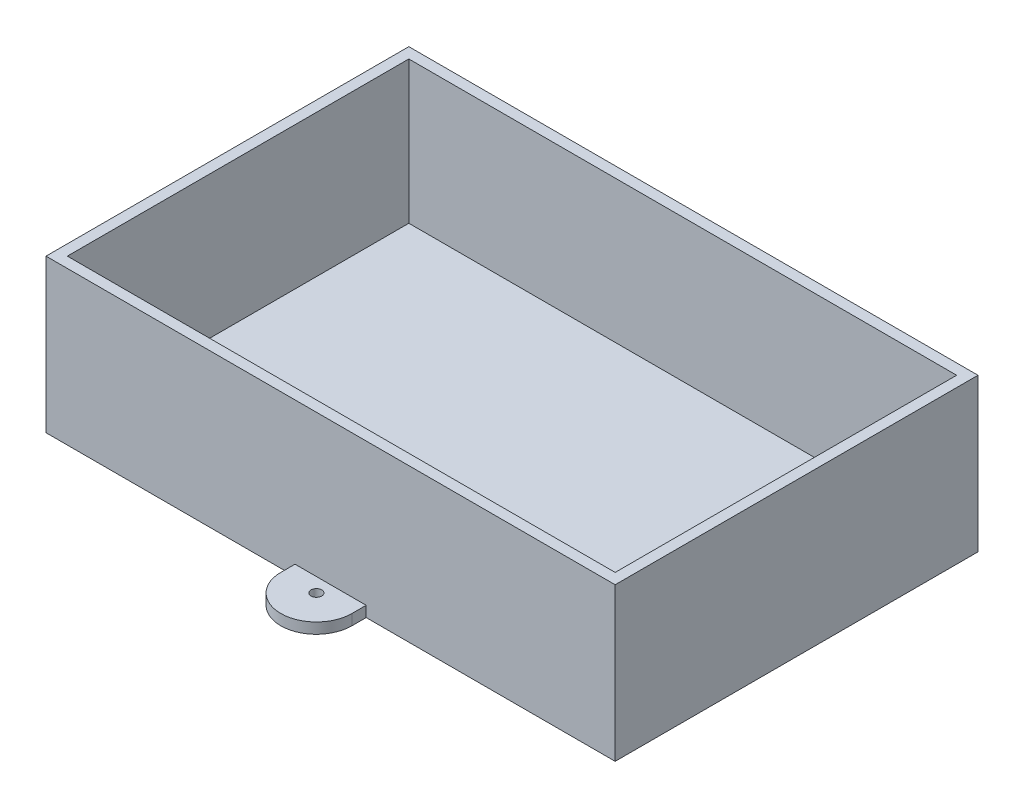
ISO-10303-21;
HEADER;
FILE_DESCRIPTION(('STEP AP214'),'2;1');
FILE_NAME('part.step','',(''),(''),'','','');
FILE_SCHEMA(('AUTOMOTIVE_DESIGN { 1 0 10303 214 1 1 1 1 }'));
ENDSEC;
DATA;
#1=APPLICATION_CONTEXT('core data for automotive mechanical design processes');
#2=APPLICATION_PROTOCOL_DEFINITION('international standard','automotive_design',2000,#1);
#3=PRODUCT_CONTEXT('',#1,'mechanical');
#4=PRODUCT('Part','Part','',(#3));
#5=PRODUCT_RELATED_PRODUCT_CATEGORY('part','',(#4));
#6=PRODUCT_DEFINITION_FORMATION('','',#4);
#7=PRODUCT_DEFINITION_CONTEXT('part definition',#1,'design');
#8=PRODUCT_DEFINITION('design','',#6,#7);
#9=PRODUCT_DEFINITION_SHAPE('','',#8);
#10=(LENGTH_UNIT() NAMED_UNIT(*) SI_UNIT(.MILLI.,.METRE.));
#11=(NAMED_UNIT(*) PLANE_ANGLE_UNIT() SI_UNIT($,.RADIAN.));
#12=(NAMED_UNIT(*) SI_UNIT($,.STERADIAN.) SOLID_ANGLE_UNIT());
#13=UNCERTAINTY_MEASURE_WITH_UNIT(LENGTH_MEASURE(1.E-05),#10,'distance_accuracy_value','');
#14=(GEOMETRIC_REPRESENTATION_CONTEXT(3) GLOBAL_UNCERTAINTY_ASSIGNED_CONTEXT((#13)) GLOBAL_UNIT_ASSIGNED_CONTEXT((#10,
#11,#12)) REPRESENTATION_CONTEXT('',''));
#15=CARTESIAN_POINT('',(0.,0.,0.));
#16=DIRECTION('',(0.,0.,1.));
#17=DIRECTION('',(1.,0.,0.));
#18=AXIS2_PLACEMENT_3D('',#15,#16,#17);
#19=CARTESIAN_POINT('',(-3.,40.,-3.));
#20=DIRECTION('',(0.,0.,1.));
#21=DIRECTION('',(1.,0.,0.));
#22=AXIS2_PLACEMENT_3D('',#19,#20,#21);
#23=PLANE('',#22);
#24=DIRECTION('',(0.,-1.,0.));
#25=VECTOR('',#24,1.);
#26=CARTESIAN_POINT('',(87.,40.,-3.));
#27=LINE('',#26,#25);
#28=CARTESIAN_POINT('',(87.,0.,-3.));
#29=VERTEX_POINT('',#28);
#30=CARTESIAN_POINT('',(87.,-3.,-3.));
#31=VERTEX_POINT('',#30);
#32=EDGE_CURVE('E233',#29,#31,#27,.T.);
#33=ORIENTED_EDGE('',*,*,#32,.F.);
#34=DIRECTION('',(1.,0.,0.));
#35=VECTOR('',#34,1.);
#36=CARTESIAN_POINT('',(-3.,0.,-3.));
#37=LINE('',#36,#35);
#38=CARTESIAN_POINT('',(67.,0.,-3.));
#39=VERTEX_POINT('',#38);
#40=EDGE_CURVE('E235',#39,#29,#37,.T.);
#41=ORIENTED_EDGE('',*,*,#40,.F.);
#42=DIRECTION('',(0.,-1.,0.));
#43=VECTOR('',#42,1.);
#44=CARTESIAN_POINT('',(67.,40.,-3.));
#45=LINE('',#44,#43);
#46=CARTESIAN_POINT('',(67.,-3.,-3.));
#47=VERTEX_POINT('',#46);
#48=EDGE_CURVE('E228',#39,#47,#45,.T.);
#49=ORIENTED_EDGE('',*,*,#48,.T.);
#50=DIRECTION('',(1.,0.,0.));
#51=VECTOR('',#50,1.);
#52=CARTESIAN_POINT('',(-3.,-3.,-3.));
#53=LINE('',#52,#51);
#54=CARTESIAN_POINT('',(-3.,-3.,-3.));
#55=VERTEX_POINT('',#54);
#56=EDGE_CURVE('E241',#55,#47,#53,.T.);
#57=ORIENTED_EDGE('',*,*,#56,.F.);
#58=DIRECTION('',(0.,-1.,0.));
#59=VECTOR('',#58,1.);
#60=CARTESIAN_POINT('',(-3.,40.,-3.));
#61=LINE('',#60,#59);
#62=CARTESIAN_POINT('',(-3.,40.,-3.));
#63=VERTEX_POINT('',#62);
#64=EDGE_CURVE('E76',#63,#55,#61,.T.);
#65=ORIENTED_EDGE('',*,*,#64,.F.);
#66=DIRECTION('',(-1.,0.,0.));
#67=VECTOR('',#66,1.);
#68=CARTESIAN_POINT('',(-3.,40.,-3.));
#69=LINE('',#68,#67);
#70=CARTESIAN_POINT('',(157.,40.,-3.));
#71=VERTEX_POINT('',#70);
#72=EDGE_CURVE('E282',#71,#63,#69,.T.);
#73=ORIENTED_EDGE('',*,*,#72,.F.);
#74=DIRECTION('',(0.,-1.,0.));
#75=VECTOR('',#74,1.);
#76=CARTESIAN_POINT('',(157.,40.,-3.));
#77=LINE('',#76,#75);
#78=CARTESIAN_POINT('',(157.,-3.,-3.));
#79=VERTEX_POINT('',#78);
#80=EDGE_CURVE('E291',#71,#79,#77,.T.);
#81=ORIENTED_EDGE('',*,*,#80,.T.);
#82=EDGE_CURVE('E240',#31,#79,#53,.T.);
#83=ORIENTED_EDGE('',*,*,#82,.F.);
#84=EDGE_LOOP('',(#33,#41,#49,#57,#65,#73,#81,#83));
#85=FACE_BOUND('',#84,.T.);
#86=ADVANCED_FACE('F69',(#85),#23,.F.);
#87=CARTESIAN_POINT('',(-2.99999999999999,40.,99.));
#88=DIRECTION('',(0.,0.,-1.));
#89=DIRECTION('',(-1.,0.,0.));
#90=AXIS2_PLACEMENT_3D('',#87,#88,#89);
#91=PLANE('',#90);
#92=DIRECTION('',(0.,1.,0.));
#93=VECTOR('',#92,1.);
#94=CARTESIAN_POINT('',(87.,40.,99.));
#95=LINE('',#94,#93);
#96=CARTESIAN_POINT('',(87.,-3.,99.));
#97=VERTEX_POINT('',#96);
#98=CARTESIAN_POINT('',(87.,0.,99.));
#99=VERTEX_POINT('',#98);
#100=EDGE_CURVE('E231',#97,#99,#95,.T.);
#101=ORIENTED_EDGE('',*,*,#100,.F.);
#102=DIRECTION('',(-1.,0.,0.));
#103=VECTOR('',#102,1.);
#104=CARTESIAN_POINT('',(-2.99999999999999,-3.,99.));
#105=LINE('',#104,#103);
#106=CARTESIAN_POINT('',(157.,-3.,99.));
#107=VERTEX_POINT('',#106);
#108=EDGE_CURVE('E248',#107,#97,#105,.T.);
#109=ORIENTED_EDGE('',*,*,#108,.F.);
#110=DIRECTION('',(0.,-1.,0.));
#111=VECTOR('',#110,1.);
#112=CARTESIAN_POINT('',(157.,40.,99.));
#113=LINE('',#112,#111);
#114=CARTESIAN_POINT('',(157.,40.,99.));
#115=VERTEX_POINT('',#114);
#116=EDGE_CURVE('E294',#115,#107,#113,.T.);
#117=ORIENTED_EDGE('',*,*,#116,.F.);
#118=DIRECTION('',(1.,0.,0.));
#119=VECTOR('',#118,1.);
#120=CARTESIAN_POINT('',(-2.99999999999999,40.,99.));
#121=LINE('',#120,#119);
#122=CARTESIAN_POINT('',(-2.99999999999999,40.,99.));
#123=VERTEX_POINT('',#122);
#124=EDGE_CURVE('E287',#123,#115,#121,.T.);
#125=ORIENTED_EDGE('',*,*,#124,.F.);
#126=DIRECTION('',(0.,-1.,0.));
#127=VECTOR('',#126,1.);
#128=CARTESIAN_POINT('',(-2.99999999999999,40.,99.));
#129=LINE('',#128,#127);
#130=CARTESIAN_POINT('',(-2.99999999999999,-3.,99.));
#131=VERTEX_POINT('',#130);
#132=EDGE_CURVE('E296',#123,#131,#129,.T.);
#133=ORIENTED_EDGE('',*,*,#132,.T.);
#134=CARTESIAN_POINT('',(67.,-3.,99.));
#135=VERTEX_POINT('',#134);
#136=EDGE_CURVE('E247',#135,#131,#105,.T.);
#137=ORIENTED_EDGE('',*,*,#136,.F.);
#138=DIRECTION('',(0.,1.,0.));
#139=VECTOR('',#138,1.);
#140=CARTESIAN_POINT('',(67.,40.,99.));
#141=LINE('',#140,#139);
#142=CARTESIAN_POINT('',(67.,0.,99.));
#143=VERTEX_POINT('',#142);
#144=EDGE_CURVE('E221',#135,#143,#141,.T.);
#145=ORIENTED_EDGE('',*,*,#144,.T.);
#146=DIRECTION('',(-1.,0.,0.));
#147=VECTOR('',#146,1.);
#148=CARTESIAN_POINT('',(-2.99999999999999,0.,99.));
#149=LINE('',#148,#147);
#150=EDGE_CURVE('E12',#99,#143,#149,.T.);
#151=ORIENTED_EDGE('',*,*,#150,.F.);
#152=EDGE_LOOP('',(#101,#109,#117,#125,#133,#137,#145,#151));
#153=FACE_BOUND('',#152,.T.);
#154=ADVANCED_FACE('F314',(#153),#91,.F.);
#155=CARTESIAN_POINT('',(0.,40.,0.));
#156=DIRECTION('',(0.,-1.,0.));
#157=DIRECTION('',(0.,0.,-1.));
#158=AXIS2_PLACEMENT_3D('',#155,#156,#157);
#159=PLANE('',#158);
#160=ORIENTED_EDGE('',*,*,#72,.T.);
#161=DIRECTION('',(0.,0.,1.));
#162=VECTOR('',#161,1.);
#163=CARTESIAN_POINT('',(-3.,40.,-3.));
#164=LINE('',#163,#162);
#165=EDGE_CURVE('E285',#63,#123,#164,.T.);
#166=ORIENTED_EDGE('',*,*,#165,.T.);
#167=ORIENTED_EDGE('',*,*,#124,.T.);
#168=DIRECTION('',(0.,0.,-1.));
#169=VECTOR('',#168,1.);
#170=CARTESIAN_POINT('',(157.,40.,-3.));
#171=LINE('',#170,#169);
#172=EDGE_CURVE('E289',#115,#71,#171,.T.);
#173=ORIENTED_EDGE('',*,*,#172,.T.);
#174=EDGE_LOOP('',(#160,#166,#167,#173));
#175=FACE_BOUND('',#174,.T.);
#176=DIRECTION('',(0.,0.,1.));
#177=VECTOR('',#176,1.);
#178=CARTESIAN_POINT('',(0.,40.,0.));
#179=LINE('',#178,#177);
#180=CARTESIAN_POINT('',(0.,40.,0.));
#181=VERTEX_POINT('',#180);
#182=CARTESIAN_POINT('',(0.,40.,96.));
#183=VERTEX_POINT('',#182);
#184=EDGE_CURVE('E252',#181,#183,#179,.T.);
#185=ORIENTED_EDGE('',*,*,#184,.F.);
#186=DIRECTION('',(-1.,0.,0.));
#187=VECTOR('',#186,1.);
#188=CARTESIAN_POINT('',(0.,40.,0.));
#189=LINE('',#188,#187);
#190=CARTESIAN_POINT('',(154.,40.,0.));
#191=VERTEX_POINT('',#190);
#192=EDGE_CURVE('E260',#191,#181,#189,.T.);
#193=ORIENTED_EDGE('',*,*,#192,.F.);
#194=DIRECTION('',(0.,0.,-1.));
#195=VECTOR('',#194,1.);
#196=CARTESIAN_POINT('',(154.,40.,0.));
#197=LINE('',#196,#195);
#198=CARTESIAN_POINT('',(154.,40.,96.));
#199=VERTEX_POINT('',#198);
#200=EDGE_CURVE('E257',#199,#191,#197,.T.);
#201=ORIENTED_EDGE('',*,*,#200,.F.);
#202=DIRECTION('',(1.,0.,0.));
#203=VECTOR('',#202,1.);
#204=CARTESIAN_POINT('',(0.,40.,96.));
#205=LINE('',#204,#203);
#206=EDGE_CURVE('E254',#183,#199,#205,.T.);
#207=ORIENTED_EDGE('',*,*,#206,.F.);
#208=EDGE_LOOP('',(#185,#193,#201,#207));
#209=FACE_BOUND('',#208,.T.);
#210=ADVANCED_FACE('F319',(#175,#209),#159,.F.);
#211=CARTESIAN_POINT('',(-3.,40.,-3.));
#212=DIRECTION('',(1.,0.,0.));
#213=DIRECTION('',(0.,0.,-1.));
#214=AXIS2_PLACEMENT_3D('',#211,#212,#213);
#215=PLANE('',#214);
#216=ORIENTED_EDGE('',*,*,#64,.T.);
#217=DIRECTION('',(0.,0.,-1.));
#218=VECTOR('',#217,1.);
#219=CARTESIAN_POINT('',(-2.99999999999999,-3.,99.));
#220=LINE('',#219,#218);
#221=EDGE_CURVE('E237',#131,#55,#220,.T.);
#222=ORIENTED_EDGE('',*,*,#221,.F.);
#223=ORIENTED_EDGE('',*,*,#132,.F.);
#224=ORIENTED_EDGE('',*,*,#165,.F.);
#225=EDGE_LOOP('',(#216,#222,#223,#224));
#226=FACE_BOUND('',#225,.T.);
#227=ADVANCED_FACE('F302',(#226),#215,.F.);
#228=CARTESIAN_POINT('',(157.,40.,-3.));
#229=DIRECTION('',(-1.,0.,0.));
#230=DIRECTION('',(0.,0.,1.));
#231=AXIS2_PLACEMENT_3D('',#228,#229,#230);
#232=PLANE('',#231);
#233=ORIENTED_EDGE('',*,*,#116,.T.);
#234=DIRECTION('',(0.,0.,1.));
#235=VECTOR('',#234,1.);
#236=CARTESIAN_POINT('',(157.,-3.,99.));
#237=LINE('',#236,#235);
#238=EDGE_CURVE('E244',#79,#107,#237,.T.);
#239=ORIENTED_EDGE('',*,*,#238,.F.);
#240=ORIENTED_EDGE('',*,*,#80,.F.);
#241=ORIENTED_EDGE('',*,*,#172,.F.);
#242=EDGE_LOOP('',(#233,#239,#240,#241));
#243=FACE_BOUND('',#242,.T.);
#244=ADVANCED_FACE('F325',(#243),#232,.F.);
#245=CARTESIAN_POINT('',(0.,40.,0.));
#246=DIRECTION('',(1.,0.,0.));
#247=DIRECTION('',(0.,0.,-1.));
#248=AXIS2_PLACEMENT_3D('',#245,#246,#247);
#249=PLANE('',#248);
#250=DIRECTION('',(0.,0.,1.));
#251=VECTOR('',#250,1.);
#252=CARTESIAN_POINT('',(0.,0.,0.));
#253=LINE('',#252,#251);
#254=CARTESIAN_POINT('',(0.,0.,0.));
#255=VERTEX_POINT('',#254);
#256=CARTESIAN_POINT('',(0.,0.,96.));
#257=VERTEX_POINT('',#256);
#258=EDGE_CURVE('E251',#255,#257,#253,.T.);
#259=ORIENTED_EDGE('',*,*,#258,.F.);
#260=DIRECTION('',(0.,-1.,0.));
#261=VECTOR('',#260,1.);
#262=CARTESIAN_POINT('',(0.,40.,0.));
#263=LINE('',#262,#261);
#264=EDGE_CURVE('E262',#181,#255,#263,.T.);
#265=ORIENTED_EDGE('',*,*,#264,.F.);
#266=ORIENTED_EDGE('',*,*,#184,.T.);
#267=DIRECTION('',(0.,-1.,0.));
#268=VECTOR('',#267,1.);
#269=CARTESIAN_POINT('',(0.,40.,96.));
#270=LINE('',#269,#268);
#271=EDGE_CURVE('E279',#183,#257,#270,.T.);
#272=ORIENTED_EDGE('',*,*,#271,.T.);
#273=EDGE_LOOP('',(#259,#265,#266,#272));
#274=FACE_BOUND('',#273,.T.);
#275=ADVANCED_FACE('F358',(#274),#249,.T.);
#276=CARTESIAN_POINT('',(0.,40.,96.));
#277=DIRECTION('',(0.,0.,-1.));
#278=DIRECTION('',(-1.,0.,0.));
#279=AXIS2_PLACEMENT_3D('',#276,#277,#278);
#280=PLANE('',#279);
#281=DIRECTION('',(1.,0.,0.));
#282=VECTOR('',#281,1.);
#283=CARTESIAN_POINT('',(0.,0.,96.));
#284=LINE('',#283,#282);
#285=CARTESIAN_POINT('',(154.,0.,96.));
#286=VERTEX_POINT('',#285);
#287=EDGE_CURVE('E265',#257,#286,#284,.T.);
#288=ORIENTED_EDGE('',*,*,#287,.F.);
#289=ORIENTED_EDGE('',*,*,#271,.F.);
#290=ORIENTED_EDGE('',*,*,#206,.T.);
#291=DIRECTION('',(0.,-1.,0.));
#292=VECTOR('',#291,1.);
#293=CARTESIAN_POINT('',(154.,40.,96.));
#294=LINE('',#293,#292);
#295=EDGE_CURVE('E276',#199,#286,#294,.T.);
#296=ORIENTED_EDGE('',*,*,#295,.T.);
#297=EDGE_LOOP('',(#288,#289,#290,#296));
#298=FACE_BOUND('',#297,.T.);
#299=ADVANCED_FACE('F362',(#298),#280,.T.);
#300=CARTESIAN_POINT('',(154.,40.,0.));
#301=DIRECTION('',(-1.,0.,0.));
#302=DIRECTION('',(0.,0.,1.));
#303=AXIS2_PLACEMENT_3D('',#300,#301,#302);
#304=PLANE('',#303);
#305=DIRECTION('',(0.,0.,-1.));
#306=VECTOR('',#305,1.);
#307=CARTESIAN_POINT('',(154.,0.,0.));
#308=LINE('',#307,#306);
#309=CARTESIAN_POINT('',(154.,0.,0.));
#310=VERTEX_POINT('',#309);
#311=EDGE_CURVE('E267',#286,#310,#308,.T.);
#312=ORIENTED_EDGE('',*,*,#311,.F.);
#313=ORIENTED_EDGE('',*,*,#295,.F.);
#314=ORIENTED_EDGE('',*,*,#200,.T.);
#315=DIRECTION('',(0.,-1.,0.));
#316=VECTOR('',#315,1.);
#317=CARTESIAN_POINT('',(154.,40.,0.));
#318=LINE('',#317,#316);
#319=EDGE_CURVE('E273',#191,#310,#318,.T.);
#320=ORIENTED_EDGE('',*,*,#319,.T.);
#321=EDGE_LOOP('',(#312,#313,#314,#320));
#322=FACE_BOUND('',#321,.T.);
#323=ADVANCED_FACE('F368',(#322),#304,.T.);
#324=CARTESIAN_POINT('',(0.,40.,0.));
#325=DIRECTION('',(0.,0.,1.));
#326=DIRECTION('',(1.,0.,0.));
#327=AXIS2_PLACEMENT_3D('',#324,#325,#326);
#328=PLANE('',#327);
#329=DIRECTION('',(-1.,0.,0.));
#330=VECTOR('',#329,1.);
#331=CARTESIAN_POINT('',(0.,0.,0.));
#332=LINE('',#331,#330);
#333=EDGE_CURVE('E255',#310,#255,#332,.T.);
#334=ORIENTED_EDGE('',*,*,#333,.F.);
#335=ORIENTED_EDGE('',*,*,#319,.F.);
#336=ORIENTED_EDGE('',*,*,#192,.T.);
#337=ORIENTED_EDGE('',*,*,#264,.T.);
#338=EDGE_LOOP('',(#334,#335,#336,#337));
#339=FACE_BOUND('',#338,.T.);
#340=ADVANCED_FACE('F375',(#339),#328,.T.);
#341=CARTESIAN_POINT('',(0.,0.,0.));
#342=DIRECTION('',(0.,-1.,0.));
#343=DIRECTION('',(0.,0.,-1.));
#344=AXIS2_PLACEMENT_3D('',#341,#342,#343);
#345=PLANE('',#344);
#346=ORIENTED_EDGE('',*,*,#287,.T.);
#347=ORIENTED_EDGE('',*,*,#311,.T.);
#348=ORIENTED_EDGE('',*,*,#333,.T.);
#349=ORIENTED_EDGE('',*,*,#258,.T.);
#350=EDGE_LOOP('',(#346,#347,#348,#349));
#351=FACE_BOUND('',#350,.T.);
#352=ADVANCED_FACE('F379',(#351),#345,.F.);
#353=CARTESIAN_POINT('',(0.,-3.,0.));
#354=DIRECTION('',(0.,-1.,0.));
#355=DIRECTION('',(0.,0.,-1.));
#356=AXIS2_PLACEMENT_3D('',#353,#354,#355);
#357=PLANE('',#356);
#358=ORIENTED_EDGE('',*,*,#56,.T.);
#359=DIRECTION('',(0.,0.,-1.));
#360=VECTOR('',#359,1.);
#361=CARTESIAN_POINT('',(67.,-3.,103.));
#362=LINE('',#361,#360);
#363=CARTESIAN_POINT('',(67.,-3.,-7.00000000000001));
#364=VERTEX_POINT('',#363);
#365=EDGE_CURVE('E215',#47,#364,#362,.T.);
#366=ORIENTED_EDGE('',*,*,#365,.T.);
#367=CARTESIAN_POINT('',(77.,-3.,-7.00000000000001));
#368=DIRECTION('',(0.,-1.,0.));
#369=DIRECTION('',(0.,0.,-1.));
#370=AXIS2_PLACEMENT_3D('',#367,#368,#369);
#371=CIRCLE('',#370,9.99999999999998);
#372=CARTESIAN_POINT('',(87.,-3.,-7.00000000000001));
#373=VERTEX_POINT('',#372);
#374=EDGE_CURVE('E218',#364,#373,#371,.T.);
#375=ORIENTED_EDGE('',*,*,#374,.T.);
#376=DIRECTION('',(0.,0.,-1.));
#377=VECTOR('',#376,1.);
#378=CARTESIAN_POINT('',(87.,-3.,103.));
#379=LINE('',#378,#377);
#380=EDGE_CURVE('E90',#31,#373,#379,.T.);
#381=ORIENTED_EDGE('',*,*,#380,.F.);
#382=ORIENTED_EDGE('',*,*,#82,.T.);
#383=ORIENTED_EDGE('',*,*,#238,.T.);
#384=ORIENTED_EDGE('',*,*,#108,.T.);
#385=CARTESIAN_POINT('',(87.,-3.,103.));
#386=VERTEX_POINT('',#385);
#387=EDGE_CURVE('E202',#386,#97,#379,.T.);
#388=ORIENTED_EDGE('',*,*,#387,.F.);
#389=CARTESIAN_POINT('',(77.,-3.,103.));
#390=DIRECTION('',(0.,-1.,0.));
#391=DIRECTION('',(0.,0.,-1.));
#392=AXIS2_PLACEMENT_3D('',#389,#390,#391);
#393=CIRCLE('',#392,10.);
#394=CARTESIAN_POINT('',(67.,-3.,103.));
#395=VERTEX_POINT('',#394);
#396=EDGE_CURVE('E213',#386,#395,#393,.T.);
#397=ORIENTED_EDGE('',*,*,#396,.T.);
#398=EDGE_CURVE('E83',#395,#135,#362,.T.);
#399=ORIENTED_EDGE('',*,*,#398,.T.);
#400=ORIENTED_EDGE('',*,*,#136,.T.);
#401=ORIENTED_EDGE('',*,*,#221,.T.);
#402=EDGE_LOOP('',(#358,#366,#375,#381,#382,#383,#384,#388,#397,#399,#400,#401));
#403=FACE_BOUND('',#402,.T.);
#404=CARTESIAN_POINT('',(77.,-3.,103.));
#405=DIRECTION('',(0.,-1.,0.));
#406=DIRECTION('',(0.,0.,-1.));
#407=AXIS2_PLACEMENT_3D('',#404,#405,#406);
#408=CIRCLE('',#407,1.5);
#409=CARTESIAN_POINT('',(77.,-3.,101.5));
#410=VERTEX_POINT('',#409);
#411=EDGE_CURVE('E206',#410,#410,#408,.T.);
#412=ORIENTED_EDGE('',*,*,#411,.F.);
#413=EDGE_LOOP('',(#412));
#414=FACE_BOUND('',#413,.T.);
#415=CARTESIAN_POINT('',(77.,-3.,-7.00000000000001));
#416=DIRECTION('',(0.,-1.,0.));
#417=DIRECTION('',(0.,0.,-1.));
#418=AXIS2_PLACEMENT_3D('',#415,#416,#417);
#419=CIRCLE('',#418,1.5);
#420=CARTESIAN_POINT('',(77.,-3.,-8.5));
#421=VERTEX_POINT('',#420);
#422=EDGE_CURVE('E424',#421,#421,#419,.T.);
#423=ORIENTED_EDGE('',*,*,#422,.F.);
#424=EDGE_LOOP('',(#423));
#425=FACE_BOUND('',#424,.T.);
#426=ADVANCED_FACE('F308',(#403,#414,#425),#357,.T.);
#427=CARTESIAN_POINT('',(77.,0.,103.));
#428=DIRECTION('',(0.,-1.,0.));
#429=DIRECTION('',(0.,0.,-1.));
#430=AXIS2_PLACEMENT_3D('',#427,#428,#429);
#431=CYLINDRICAL_SURFACE('',#430,10.);
#432=ORIENTED_EDGE('',*,*,#396,.F.);
#433=DIRECTION('',(0.,-1.,0.));
#434=VECTOR('',#433,1.);
#435=CARTESIAN_POINT('',(87.,0.,103.));
#436=LINE('',#435,#434);
#437=CARTESIAN_POINT('',(87.,0.,103.));
#438=VERTEX_POINT('',#437);
#439=EDGE_CURVE('E200',#438,#386,#436,.T.);
#440=ORIENTED_EDGE('',*,*,#439,.F.);
#441=CARTESIAN_POINT('',(77.,0.,103.));
#442=DIRECTION('',(0.,-1.,0.));
#443=DIRECTION('',(0.,0.,-1.));
#444=AXIS2_PLACEMENT_3D('',#441,#442,#443);
#445=CIRCLE('',#444,10.);
#446=CARTESIAN_POINT('',(67.,0.,103.));
#447=VERTEX_POINT('',#446);
#448=EDGE_CURVE('E194',#438,#447,#445,.T.);
#449=ORIENTED_EDGE('',*,*,#448,.T.);
#450=DIRECTION('',(0.,-1.,0.));
#451=VECTOR('',#450,1.);
#452=CARTESIAN_POINT('',(67.,0.,103.));
#453=LINE('',#452,#451);
#454=EDGE_CURVE('E179',#447,#395,#453,.T.);
#455=ORIENTED_EDGE('',*,*,#454,.T.);
#456=EDGE_LOOP('',(#432,#440,#449,#455));
#457=FACE_BOUND('',#456,.T.);
#458=ADVANCED_FACE('F199',(#457),#431,.T.);
#459=CARTESIAN_POINT('',(77.,0.,103.));
#460=DIRECTION('',(0.,-1.,0.));
#461=DIRECTION('',(0.,0.,-1.));
#462=AXIS2_PLACEMENT_3D('',#459,#460,#461);
#463=CYLINDRICAL_SURFACE('',#462,1.5);
#464=CARTESIAN_POINT('',(77.,0.,103.));
#465=DIRECTION('',(0.,-1.,0.));
#466=DIRECTION('',(0.,0.,-1.));
#467=AXIS2_PLACEMENT_3D('',#464,#465,#466);
#468=CIRCLE('',#467,1.5);
#469=CARTESIAN_POINT('',(77.,0.,101.5));
#470=VERTEX_POINT('',#469);
#471=EDGE_CURVE('E216',#470,#470,#468,.T.);
#472=ORIENTED_EDGE('',*,*,#471,.F.);
#473=EDGE_LOOP('',(#472));
#474=FACE_BOUND('',#473,.T.);
#475=ORIENTED_EDGE('',*,*,#411,.T.);
#476=EDGE_LOOP('',(#475));
#477=FACE_BOUND('',#476,.T.);
#478=ADVANCED_FACE('F387',(#474,#477),#463,.F.);
#479=CARTESIAN_POINT('',(77.,0.,103.));
#480=DIRECTION('',(0.,-1.,0.));
#481=DIRECTION('',(0.,0.,-1.));
#482=AXIS2_PLACEMENT_3D('',#479,#480,#481);
#483=PLANE('',#482);
#484=ORIENTED_EDGE('',*,*,#471,.T.);
#485=EDGE_LOOP('',(#484));
#486=FACE_BOUND('',#485,.T.);
#487=DIRECTION('',(0.,0.,-1.));
#488=VECTOR('',#487,1.);
#489=CARTESIAN_POINT('',(87.,0.,103.));
#490=LINE('',#489,#488);
#491=EDGE_CURVE('E188',#438,#99,#490,.T.);
#492=ORIENTED_EDGE('',*,*,#491,.T.);
#493=ORIENTED_EDGE('',*,*,#150,.T.);
#494=DIRECTION('',(0.,0.,-1.));
#495=VECTOR('',#494,1.);
#496=CARTESIAN_POINT('',(67.,0.,103.));
#497=LINE('',#496,#495);
#498=EDGE_CURVE('E182',#447,#143,#497,.T.);
#499=ORIENTED_EDGE('',*,*,#498,.F.);
#500=ORIENTED_EDGE('',*,*,#448,.F.);
#501=EDGE_LOOP('',(#492,#493,#499,#500));
#502=FACE_BOUND('',#501,.T.);
#503=ADVANCED_FACE('F193',(#486,#502),#483,.F.);
#504=CARTESIAN_POINT('',(67.,0.,103.));
#505=DIRECTION('',(-1.,0.,0.));
#506=DIRECTION('',(0.,0.,1.));
#507=AXIS2_PLACEMENT_3D('',#504,#505,#506);
#508=PLANE('',#507);
#509=ORIENTED_EDGE('',*,*,#144,.F.);
#510=ORIENTED_EDGE('',*,*,#398,.F.);
#511=ORIENTED_EDGE('',*,*,#454,.F.);
#512=ORIENTED_EDGE('',*,*,#498,.T.);
#513=EDGE_LOOP('',(#509,#510,#511,#512));
#514=FACE_BOUND('',#513,.T.);
#515=ADVANCED_FACE('F181',(#514),#508,.T.);
#516=CARTESIAN_POINT('',(87.,0.,103.));
#517=DIRECTION('',(-1.,0.,0.));
#518=DIRECTION('',(0.,0.,1.));
#519=AXIS2_PLACEMENT_3D('',#516,#517,#518);
#520=PLANE('',#519);
#521=ORIENTED_EDGE('',*,*,#387,.T.);
#522=ORIENTED_EDGE('',*,*,#100,.T.);
#523=ORIENTED_EDGE('',*,*,#491,.F.);
#524=ORIENTED_EDGE('',*,*,#439,.T.);
#525=EDGE_LOOP('',(#521,#522,#523,#524));
#526=FACE_BOUND('',#525,.T.);
#527=ADVANCED_FACE('F328',(#526),#520,.F.);
#528=CARTESIAN_POINT('',(77.,0.,-7.00000000000001));
#529=DIRECTION('',(0.,-1.,0.));
#530=DIRECTION('',(0.,0.,-1.));
#531=AXIS2_PLACEMENT_3D('',#528,#529,#530);
#532=CIRCLE('',#531,1.5);
#533=CARTESIAN_POINT('',(77.,0.,-8.5));
#534=VERTEX_POINT('',#533);
#535=EDGE_CURVE('E422',#534,#534,#532,.T.);
#536=ORIENTED_EDGE('',*,*,#535,.T.);
#537=EDGE_LOOP('',(#536));
#538=FACE_BOUND('',#537,.T.);
#539=CARTESIAN_POINT('',(67.,0.,-7.00000000000001));
#540=VERTEX_POINT('',#539);
#541=EDGE_CURVE('E197',#39,#540,#497,.T.);
#542=ORIENTED_EDGE('',*,*,#541,.F.);
#543=ORIENTED_EDGE('',*,*,#40,.T.);
#544=CARTESIAN_POINT('',(87.,0.,-7.00000000000001));
#545=VERTEX_POINT('',#544);
#546=EDGE_CURVE('E211',#29,#545,#490,.T.);
#547=ORIENTED_EDGE('',*,*,#546,.T.);
#548=CARTESIAN_POINT('',(77.,0.,-7.00000000000001));
#549=DIRECTION('',(0.,-1.,0.));
#550=DIRECTION('',(0.,0.,-1.));
#551=AXIS2_PLACEMENT_3D('',#548,#549,#550);
#552=CIRCLE('',#551,9.99999999999998);
#553=EDGE_CURVE('E196',#540,#545,#552,.T.);
#554=ORIENTED_EDGE('',*,*,#553,.F.);
#555=EDGE_LOOP('',(#542,#543,#547,#554));
#556=FACE_BOUND('',#555,.T.);
#557=ADVANCED_FACE('F330',(#538,#556),#483,.F.);
#558=ORIENTED_EDGE('',*,*,#546,.F.);
#559=ORIENTED_EDGE('',*,*,#32,.T.);
#560=ORIENTED_EDGE('',*,*,#380,.T.);
#561=DIRECTION('',(0.,-1.,0.));
#562=VECTOR('',#561,1.);
#563=CARTESIAN_POINT('',(87.,0.,-7.00000000000001));
#564=LINE('',#563,#562);
#565=EDGE_CURVE('E222',#545,#373,#564,.T.);
#566=ORIENTED_EDGE('',*,*,#565,.F.);
#567=EDGE_LOOP('',(#558,#559,#560,#566));
#568=FACE_BOUND('',#567,.T.);
#569=ADVANCED_FACE('F332',(#568),#520,.F.);
#570=ORIENTED_EDGE('',*,*,#48,.F.);
#571=ORIENTED_EDGE('',*,*,#541,.T.);
#572=DIRECTION('',(0.,-1.,0.));
#573=VECTOR('',#572,1.);
#574=CARTESIAN_POINT('',(67.,0.,-7.00000000000001));
#575=LINE('',#574,#573);
#576=EDGE_CURVE('E187',#540,#364,#575,.T.);
#577=ORIENTED_EDGE('',*,*,#576,.T.);
#578=ORIENTED_EDGE('',*,*,#365,.F.);
#579=EDGE_LOOP('',(#570,#571,#577,#578));
#580=FACE_BOUND('',#579,.T.);
#581=ADVANCED_FACE('F340',(#580),#508,.T.);
#582=CARTESIAN_POINT('',(77.,0.,-7.00000000000001));
#583=DIRECTION('',(0.,-1.,0.));
#584=DIRECTION('',(0.,0.,-1.));
#585=AXIS2_PLACEMENT_3D('',#582,#583,#584);
#586=CYLINDRICAL_SURFACE('',#585,9.99999999999998);
#587=ORIENTED_EDGE('',*,*,#374,.F.);
#588=ORIENTED_EDGE('',*,*,#576,.F.);
#589=ORIENTED_EDGE('',*,*,#553,.T.);
#590=ORIENTED_EDGE('',*,*,#565,.T.);
#591=EDGE_LOOP('',(#587,#588,#589,#590));
#592=FACE_BOUND('',#591,.T.);
#593=ADVANCED_FACE('F389',(#592),#586,.T.);
#594=CARTESIAN_POINT('',(77.,0.,-7.00000000000001));
#595=DIRECTION('',(0.,-1.,0.));
#596=DIRECTION('',(0.,0.,-1.));
#597=AXIS2_PLACEMENT_3D('',#594,#595,#596);
#598=CYLINDRICAL_SURFACE('',#597,1.5);
#599=ORIENTED_EDGE('',*,*,#535,.F.);
#600=EDGE_LOOP('',(#599));
#601=FACE_BOUND('',#600,.T.);
#602=ORIENTED_EDGE('',*,*,#422,.T.);
#603=EDGE_LOOP('',(#602));
#604=FACE_BOUND('',#603,.T.);
#605=ADVANCED_FACE('F392',(#601,#604),#598,.F.);
#606=CLOSED_SHELL('',(#86,#154,#210,#227,#244,#275,#299,#323,#340,#352,#426,#458,#478,#503,#515,
#527,#557,#569,#581,#593,#605));
#607=MANIFOLD_SOLID_BREP('B2',#606);
#608=ADVANCED_BREP_SHAPE_REPRESENTATION('',(#18,#607),#14);
#609=SHAPE_DEFINITION_REPRESENTATION(#9,#608);
ENDSEC;
END-ISO-10303-21;
